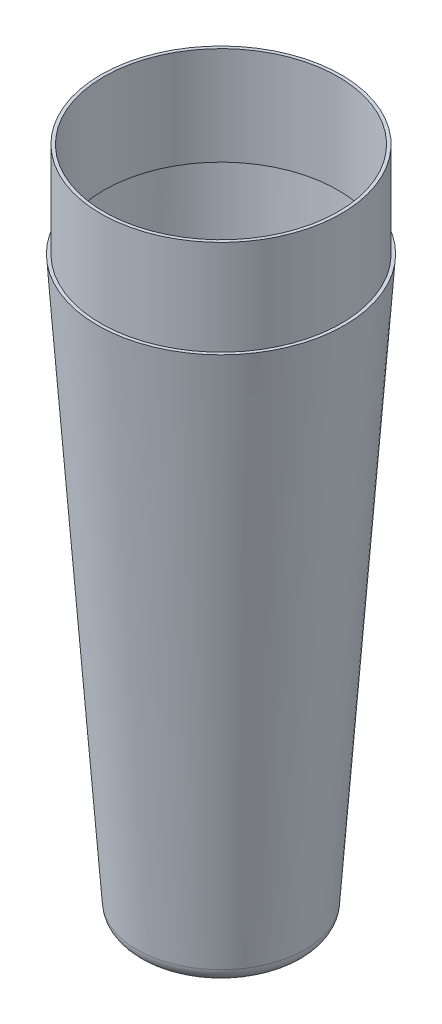
ISO-10303-21;
HEADER;
FILE_DESCRIPTION(('STEP AP214'),'2;1');
FILE_NAME('part.step','',(''),(''),'','','');
FILE_SCHEMA(('AUTOMOTIVE_DESIGN { 1 0 10303 214 1 1 1 1 }'));
ENDSEC;
DATA;
#1=APPLICATION_CONTEXT('core data for automotive mechanical design processes');
#2=APPLICATION_PROTOCOL_DEFINITION('international standard','automotive_design',2000,#1);
#3=PRODUCT_CONTEXT('',#1,'mechanical');
#4=PRODUCT('Part','Part','',(#3));
#5=PRODUCT_RELATED_PRODUCT_CATEGORY('part','',(#4));
#6=PRODUCT_DEFINITION_FORMATION('','',#4);
#7=PRODUCT_DEFINITION_CONTEXT('part definition',#1,'design');
#8=PRODUCT_DEFINITION('design','',#6,#7);
#9=PRODUCT_DEFINITION_SHAPE('','',#8);
#10=(LENGTH_UNIT() NAMED_UNIT(*) SI_UNIT(.MILLI.,.METRE.));
#11=(NAMED_UNIT(*) PLANE_ANGLE_UNIT() SI_UNIT($,.RADIAN.));
#12=(NAMED_UNIT(*) SI_UNIT($,.STERADIAN.) SOLID_ANGLE_UNIT());
#13=UNCERTAINTY_MEASURE_WITH_UNIT(LENGTH_MEASURE(1.E-05),#10,'distance_accuracy_value','');
#14=(GEOMETRIC_REPRESENTATION_CONTEXT(3) GLOBAL_UNCERTAINTY_ASSIGNED_CONTEXT((#13)) GLOBAL_UNIT_ASSIGNED_CONTEXT((#10,
#11,#12)) REPRESENTATION_CONTEXT('',''));
#15=CARTESIAN_POINT('',(0.,0.,0.));
#16=DIRECTION('',(0.,0.,1.));
#17=DIRECTION('',(1.,0.,0.));
#18=AXIS2_PLACEMENT_3D('',#15,#16,#17);
#19=CARTESIAN_POINT('',(0.,-112.,0.));
#20=DIRECTION('',(0.,-1.,0.));
#21=DIRECTION('',(1.,0.,0.));
#22=AXIS2_PLACEMENT_3D('',#19,#20,#21);
#23=PLANE('',#22);
#24=DIRECTION('',(0.,0.,1.));
#25=VECTOR('',#24,1.);
#26=CARTESIAN_POINT('',(-2.00000000000005,-112.,0.));
#27=LINE('',#26,#25);
#28=CARTESIAN_POINT('',(-2.00000000000005,-112.,-25.2208247287831));
#29=VERTEX_POINT('',#28);
#30=CARTESIAN_POINT('',(-2.00000000000005,-112.,25.2208247287831));
#31=VERTEX_POINT('',#30);
#32=EDGE_CURVE('E97',#29,#31,#27,.T.);
#33=ORIENTED_EDGE('',*,*,#32,.F.);
#34=CARTESIAN_POINT('',(0.,-112.,0.));
#35=DIRECTION('',(0.,1.,0.));
#36=DIRECTION('',(-1.,0.,0.));
#37=AXIS2_PLACEMENT_3D('',#34,#35,#36);
#38=CIRCLE('',#37,25.3);
#39=EDGE_CURVE('E102',#29,#31,#38,.T.);
#40=ORIENTED_EDGE('',*,*,#39,.T.);
#41=EDGE_LOOP('',(#33,#40));
#42=FACE_BOUND('',#41,.T.);
#43=ADVANCED_FACE('F30',(#42),#23,.F.);
#44=CARTESIAN_POINT('',(0.,62.1166994767691,0.));
#45=DIRECTION('',(0.,1.,0.));
#46=DIRECTION('',(-1.,0.,0.));
#47=AXIS2_PLACEMENT_3D('',#44,#45,#46);
#48=CONICAL_SURFACE('',#47,37.5859401150991,0.0704447682190461);
#49=CARTESIAN_POINT('',(0.,62.1166994767691,0.));
#50=DIRECTION('',(0.,1.,0.));
#51=DIRECTION('',(-1.,0.,0.));
#52=AXIS2_PLACEMENT_3D('',#49,#50,#51);
#53=CIRCLE('',#52,37.5859401150991);
#54=CARTESIAN_POINT('',(-37.5859401150991,62.1166994767691,0.));
#55=VERTEX_POINT('',#54);
#56=EDGE_CURVE('E108',#55,#55,#53,.T.);
#57=ORIENTED_EDGE('',*,*,#56,.T.);
#58=EDGE_LOOP('',(#57));
#59=FACE_BOUND('',#58,.T.);
#60=CARTESIAN_POINT('',(-2.00000000000005,-53.9138144700276,-29.3305406923571));
#61=CARTESIAN_POINT('',(-2.00000000000005,-61.9847140664111,-28.7597219553806));
#62=CARTESIAN_POINT('',(-2.00000000000005,-70.0556084181839,-28.1888290536397));
#63=CARTESIAN_POINT('',(-2.00000000000005,-86.197384059442,-27.0468587073202));
#64=CARTESIAN_POINT('',(-2.00000000000005,-94.2682653489273,-26.4757812627418));
#65=CARTESIAN_POINT('',(-2.00000000000005,-110.410012307659,-25.3334056163694));
#66=CARTESIAN_POINT('',(-2.00000000000005,-118.480877976906,-24.7621074145755));
#67=CARTESIAN_POINT('',(-2.00000000000005,-134.622589855425,-23.6192360748917));
#68=CARTESIAN_POINT('',(-2.00000000000005,-142.693436064698,-23.0476629370016));
#69=CARTESIAN_POINT('',(-2.00000000000005,-150.764270618845,-22.4759252419963));
#70=B_SPLINE_CURVE_WITH_KNOTS('',3,(#60,#61,#62,#63,#64,#65,#66,#67,#68,#69),.UNSPECIFIED.,.F.,
.F.,(4,2,2,2,4),(0.,24.2731804459495,48.5463608726504,72.8195413063129,97.0927217593087),.UNSPECIFIED.);
#71=CARTESIAN_POINT('',(-2.00000000000005,-93.8519325969335,-26.5052055677583));
#72=VERTEX_POINT('',#71);
#73=EDGE_CURVE('E145',#72,#29,#70,.T.);
#74=ORIENTED_EDGE('',*,*,#73,.F.);
#75=CARTESIAN_POINT('',(-2.00000000000005,-93.8519325969334,-26.5052055677583));
#76=CARTESIAN_POINT('',(-1.99999964109912,-93.7954523850104,-26.5092012035915));
#77=CARTESIAN_POINT('',(-1.99760603476506,-93.7390126500785,-26.5133767748526));
#78=CARTESIAN_POINT('',(-1.98806356505948,-93.6265659189259,-26.5220511012537));
#79=CARTESIAN_POINT('',(-1.9809150601534,-93.570558890406,-26.5265498320083));
#80=CARTESIAN_POINT('',(-1.9524170156751,-93.4038976507131,-26.5404603311732));
#81=CARTESIAN_POINT('',(-1.92401469690992,-93.2944018316317,-26.5503007433039));
#82=CARTESIAN_POINT('',(-1.8492289471911,-93.0818216874483,-26.5706499999928));
#83=CARTESIAN_POINT('',(-1.80283920424937,-92.9787396277579,-26.5811590781101));
#84=CARTESIAN_POINT('',(-1.69339644525837,-92.7818457908687,-26.6022764434111));
#85=CARTESIAN_POINT('',(-1.63034519005813,-92.6880330354948,-26.612884719997));
#86=CARTESIAN_POINT('',(-1.48915526943979,-92.512091561152,-26.6335923995208));
#87=CARTESIAN_POINT('',(-1.41097919495568,-92.4299927082182,-26.6436904607539));
#88=CARTESIAN_POINT('',(-1.24179703146071,-92.2800825311433,-26.662700126658));
#89=CARTESIAN_POINT('',(-1.15078874225654,-92.2122736621267,-26.6716115273553));
#90=CARTESIAN_POINT('',(-0.958813384917244,-92.0931243846404,-26.6876140148909));
#91=CARTESIAN_POINT('',(-0.857877364281296,-92.0417346429683,-26.6947105416598));
#92=CARTESIAN_POINT('',(-0.648696361268976,-91.9566972920407,-26.7066134451485));
#93=CARTESIAN_POINT('',(-0.54045656945448,-91.9230372295861,-26.711421429095));
#94=CARTESIAN_POINT('',(-0.359575138336308,-91.8831904169167,-26.7171468673316));
#95=CARTESIAN_POINT('',(-0.288127425834697,-91.8714770503591,-26.7188416078908));
#96=CARTESIAN_POINT('',(-0.144463931153968,-91.8558488553313,-26.7211088894329));
#97=CARTESIAN_POINT('',(-0.0722493077395498,-91.8519235876559,-26.7216829325875));
#98=CARTESIAN_POINT('',(0.,-91.8519325969334,-26.7216783932438));
#99=B_SPLINE_CURVE_WITH_KNOTS('',3,(#75,#76,#77,#78,#79,#80,#81,#82,#83,#84,#85,#86,#87,#88,#89,
#90,#91,#92,#93,#94,#95,#96,#97,#98),.UNSPECIFIED.,.F.,.F.,(4,2,2,2,2,2,2,2,2,2,2,4),(0.,
0.169758602458247,0.339504408492328,0.678397870790146,1.01741036237171,1.35638704020288,
1.69621310134062,2.03609749958529,2.37495085611892,2.71356588603529,2.93042856866167,
3.14700037059582),.UNSPECIFIED.);
#100=CARTESIAN_POINT('',(0.,-91.8519325969334,-26.7216783932439));
#101=VERTEX_POINT('',#100);
#102=EDGE_CURVE('E11',#72,#101,#99,.T.);
#103=ORIENTED_EDGE('',*,*,#102,.T.);
#104=CARTESIAN_POINT('',(0.,-91.8519325969334,-26.7216783932439));
#105=CARTESIAN_POINT('',(0.0559045914415745,-91.8519326412762,-26.7216793690392));
#106=CARTESIAN_POINT('',(0.111782182408543,-91.8542780774041,-26.7213372338973));
#107=CARTESIAN_POINT('',(0.223132940230656,-91.8636327940734,-26.7199790269486));
#108=CARTESIAN_POINT('',(0.278606138249945,-91.8706417113036,-26.7189630076414));
#109=CARTESIAN_POINT('',(0.443684499036767,-91.898586221238,-26.7149278981273));
#110=CARTESIAN_POINT('',(0.552176627522144,-91.92643982581,-26.7109216560388));
#111=CARTESIAN_POINT('',(0.762882888304906,-91.9997781527207,-26.7005588010871));
#112=CARTESIAN_POINT('',(0.865094897431321,-92.0452688001743,-26.6942013983913));
#113=CARTESIAN_POINT('',(1.06042699906275,-92.152549413548,-26.6795798705328));
#114=CARTESIAN_POINT('',(1.15354759741405,-92.2143384719152,-26.6713158515404));
#115=CARTESIAN_POINT('',(1.32864189264113,-92.3528508095469,-26.6533835253543));
#116=CARTESIAN_POINT('',(1.41054866352324,-92.4296576294896,-26.6437074432609));
#117=CARTESIAN_POINT('',(1.56036311266941,-92.5958343234032,-26.6236083984379));
#118=CARTESIAN_POINT('',(1.6282676382264,-92.6852070190703,-26.6131852682153));
#119=CARTESIAN_POINT('',(1.74869467198883,-92.874800324391,-26.5921384674369));
#120=CARTESIAN_POINT('',(1.80108511554346,-92.9751046536976,-26.5815138509223));
#121=CARTESIAN_POINT('',(1.88822408856338,-93.1831222855994,-26.5607514239104));
#122=CARTESIAN_POINT('',(1.92298284943401,-93.2908312500912,-26.5506133341885));
#123=CARTESIAN_POINT('',(1.96555115658719,-93.4746031037899,-26.534486256957));
#124=CARTESIAN_POINT('',(1.97845588219058,-93.5495015894461,-26.5282242783961));
#125=CARTESIAN_POINT('',(1.99568030677068,-93.700225367144,-26.5162666668877));
#126=CARTESIAN_POINT('',(2.0000109905118,-93.7760493479264,-26.5105703181789));
#127=CARTESIAN_POINT('',(2.00000000000005,-93.8519325969334,-26.5052055677583));
#128=B_SPLINE_CURVE_WITH_KNOTS('',3,(#104,#105,#106,#107,#108,#109,#110,#111,#112,#113,#114,
#115,#116,#117,#118,#119,#120,#121,#122,#123,#124,#125,#126,#127),.UNSPECIFIED.,.F.,.F.,(4,2,2,
2,2,2,2,2,2,2,2,4),(0.,0.167610038300645,0.335207020374809,0.669725159066295,1.00435577569958,
1.33896776285442,1.67549698982164,2.01210190624716,2.35149485189112,2.69069062686982,
2.91900910508339,3.14703487982209),.UNSPECIFIED.);
#129=CARTESIAN_POINT('',(2.00000000000005,-93.8519325969334,-26.5052055677583));
#130=VERTEX_POINT('',#129);
#131=EDGE_CURVE('E159',#101,#130,#128,.T.);
#132=ORIENTED_EDGE('',*,*,#131,.T.);
#133=CARTESIAN_POINT('',(2.00000000000005,-53.9138144700276,-29.3305406923571));
#134=CARTESIAN_POINT('',(2.00000000000005,-61.9847140664111,-28.7597219553806));
#135=CARTESIAN_POINT('',(2.00000000000005,-70.0556084181839,-28.1888290536397));
#136=CARTESIAN_POINT('',(2.00000000000005,-86.197384059442,-27.0468587073202));
#137=CARTESIAN_POINT('',(2.00000000000005,-94.2682653489273,-26.4757812627418));
#138=CARTESIAN_POINT('',(2.00000000000005,-110.410012307659,-25.3334056163695));
#139=CARTESIAN_POINT('',(2.00000000000005,-118.480877976906,-24.7621074145755));
#140=CARTESIAN_POINT('',(2.00000000000005,-134.622589855425,-23.6192360748917));
#141=CARTESIAN_POINT('',(2.00000000000005,-142.693436064698,-23.0476629370016));
#142=CARTESIAN_POINT('',(2.00000000000005,-150.764270618845,-22.4759252419963));
#143=B_SPLINE_CURVE_WITH_KNOTS('',3,(#133,#134,#135,#136,#137,#138,#139,#140,#141,#142),
.UNSPECIFIED.,.F.,.F.,(4,2,2,2,4),(0.,24.2731804459495,48.5463608726504,72.8195413063129,
97.0927217593087),.UNSPECIFIED.);
#144=CARTESIAN_POINT('',(2.00000000000005,-112.,-25.2208247287832));
#145=VERTEX_POINT('',#144);
#146=EDGE_CURVE('E100',#130,#145,#143,.T.);
#147=ORIENTED_EDGE('',*,*,#146,.T.);
#148=CARTESIAN_POINT('',(2.00000000000005,-112.,25.2208247287831));
#149=VERTEX_POINT('',#148);
#150=EDGE_CURVE('E96',#149,#145,#38,.T.);
#151=ORIENTED_EDGE('',*,*,#150,.F.);
#152=CARTESIAN_POINT('',(2.00000000000005,-150.764270618845,22.4759252419963));
#153=CARTESIAN_POINT('',(2.00000000000005,-136.745453788652,23.4690087769636));
#154=CARTESIAN_POINT('',(2.00000000000005,-122.726602954231,24.4616120896159));
#155=CARTESIAN_POINT('',(2.00000000000005,-106.58486459877,25.604109386239));
#156=CARTESIAN_POINT('',(2.00000000000005,-104.462001990521,25.7543553347007));
#157=CARTESIAN_POINT('',(2.00000000000005,-86.1973918091656,27.0469682870499));
#158=CARTESIAN_POINT('',(2.00000000000005,-70.0556126947938,28.1888896437956));
#159=CARTESIAN_POINT('',(2.00000000000005,-53.9138144700276,29.3305406923571));
#160=B_SPLINE_CURVE_WITH_KNOTS('',3,(#152,#153,#154,#155,#156,#157,#158,#159),.UNSPECIFIED.,.F.,
.F.,(4,2,2,4),(0.,42.1618424601069,48.5463608825223,97.092721752),.UNSPECIFIED.);
#161=CARTESIAN_POINT('',(2.00000000000005,-93.8519325969334,26.5052055677583));
#162=VERTEX_POINT('',#161);
#163=EDGE_CURVE('E82',#149,#162,#160,.T.);
#164=ORIENTED_EDGE('',*,*,#163,.T.);
#165=CARTESIAN_POINT('',(2.00000000000005,-93.8519325969334,26.5052055677583));
#166=CARTESIAN_POINT('',(1.99999964109912,-93.7954523850104,26.5092012035915));
#167=CARTESIAN_POINT('',(1.99760603476506,-93.7390126500785,26.5133767748526));
#168=CARTESIAN_POINT('',(1.98806356505948,-93.6265659189259,26.5220511012537));
#169=CARTESIAN_POINT('',(1.9809150601534,-93.570558890406,26.5265498320083));
#170=CARTESIAN_POINT('',(1.9524170156751,-93.4038976507131,26.5404603311732));
#171=CARTESIAN_POINT('',(1.92401469690992,-93.2944018316317,26.5503007433039));
#172=CARTESIAN_POINT('',(1.8492289471911,-93.0818216874483,26.5706499999928));
#173=CARTESIAN_POINT('',(1.80283920424937,-92.9787396277579,26.5811590781101));
#174=CARTESIAN_POINT('',(1.69339644525837,-92.7818457908687,26.6022764434111));
#175=CARTESIAN_POINT('',(1.63034519005813,-92.6880330354948,26.612884719997));
#176=CARTESIAN_POINT('',(1.48915526943979,-92.512091561152,26.6335923995208));
#177=CARTESIAN_POINT('',(1.41097919495568,-92.4299927082182,26.6436904607539));
#178=CARTESIAN_POINT('',(1.24179703146071,-92.2800825311433,26.662700126658));
#179=CARTESIAN_POINT('',(1.15078874225654,-92.2122736621267,26.6716115273553));
#180=CARTESIAN_POINT('',(0.958813384917244,-92.0931243846404,26.6876140148909));
#181=CARTESIAN_POINT('',(0.857877364281296,-92.0417346429683,26.6947105416598));
#182=CARTESIAN_POINT('',(0.648696361268976,-91.9566972920407,26.7066134451485));
#183=CARTESIAN_POINT('',(0.540456569454481,-91.9230372295861,26.711421429095));
#184=CARTESIAN_POINT('',(0.359575138336308,-91.8831904169167,26.7171468673316));
#185=CARTESIAN_POINT('',(0.288127425834696,-91.8714770503591,26.7188416078908));
#186=CARTESIAN_POINT('',(0.144463931153966,-91.8558488553313,26.7211088894329));
#187=CARTESIAN_POINT('',(0.0722493077395496,-91.8519235876559,26.7216829325875));
#188=CARTESIAN_POINT('',(0.,-91.8519325969334,26.7216783932438));
#189=B_SPLINE_CURVE_WITH_KNOTS('',3,(#165,#166,#167,#168,#169,#170,#171,#172,#173,#174,#175,
#176,#177,#178,#179,#180,#181,#182,#183,#184,#185,#186,#187,#188),.UNSPECIFIED.,.F.,.F.,(4,2,2,
2,2,2,2,2,2,2,2,4),(0.,0.169758602458246,0.339504408492327,0.678397870790146,1.01741036237171,
1.35638704020288,1.69621310134062,2.03609749958529,2.37495085611892,2.71356588603529,
2.93042856866167,3.14700037059581),.UNSPECIFIED.);
#190=CARTESIAN_POINT('',(0.,-91.8519325969334,26.7216783932438));
#191=VERTEX_POINT('',#190);
#192=EDGE_CURVE('E154',#162,#191,#189,.T.);
#193=ORIENTED_EDGE('',*,*,#192,.T.);
#194=CARTESIAN_POINT('',(0.,-91.8519325969334,26.7216783932438));
#195=CARTESIAN_POINT('',(-0.0559045914415748,-91.8519326412762,26.7216793690392));
#196=CARTESIAN_POINT('',(-0.111782182408543,-91.8542780774041,26.7213372338973));
#197=CARTESIAN_POINT('',(-0.223132940230656,-91.8636327940734,26.7199790269487));
#198=CARTESIAN_POINT('',(-0.278606138249945,-91.8706417113036,26.7189630076414));
#199=CARTESIAN_POINT('',(-0.443684499036768,-91.898586221238,26.7149278981273));
#200=CARTESIAN_POINT('',(-0.552176627522145,-91.92643982581,26.7109216560388));
#201=CARTESIAN_POINT('',(-0.762882888304904,-91.9997781527207,26.7005588010871));
#202=CARTESIAN_POINT('',(-0.865094897431316,-92.0452688001743,26.6942013983913));
#203=CARTESIAN_POINT('',(-1.06042699906274,-92.152549413548,26.6795798705328));
#204=CARTESIAN_POINT('',(-1.15354759741405,-92.2143384719152,26.6713158515404));
#205=CARTESIAN_POINT('',(-1.32864189264113,-92.3528508095469,26.6533835253543));
#206=CARTESIAN_POINT('',(-1.41054866352324,-92.4296576294896,26.6437074432609));
#207=CARTESIAN_POINT('',(-1.56036311266941,-92.5958343234032,26.6236083984379));
#208=CARTESIAN_POINT('',(-1.6282676382264,-92.6852070190703,26.6131852682153));
#209=CARTESIAN_POINT('',(-1.74869467198883,-92.874800324391,26.5921384674369));
#210=CARTESIAN_POINT('',(-1.80108511554346,-92.9751046536976,26.5815138509223));
#211=CARTESIAN_POINT('',(-1.88822408856338,-93.1831222855994,26.5607514239104));
#212=CARTESIAN_POINT('',(-1.92298284943401,-93.2908312500912,26.5506133341885));
#213=CARTESIAN_POINT('',(-1.96555115658719,-93.4746031037899,26.534486256957));
#214=CARTESIAN_POINT('',(-1.97845588219058,-93.5495015894461,26.5282242783961));
#215=CARTESIAN_POINT('',(-1.99568030677068,-93.700225367144,26.5162666668877));
#216=CARTESIAN_POINT('',(-2.0000109905118,-93.7760493479264,26.5105703181789));
#217=CARTESIAN_POINT('',(-2.00000000000005,-93.8519325969334,26.5052055677583));
#218=B_SPLINE_CURVE_WITH_KNOTS('',3,(#194,#195,#196,#197,#198,#199,#200,#201,#202,#203,#204,
#205,#206,#207,#208,#209,#210,#211,#212,#213,#214,#215,#216,#217),.UNSPECIFIED.,.F.,.F.,(4,2,2,
2,2,2,2,2,2,2,2,4),(0.,0.167610038300645,0.33520702037481,0.669725159066295,1.00435577569958,
1.33896776285442,1.67549698982164,2.01210190624716,2.35149485189112,2.69069062686982,
2.91900910508339,3.1470348798221),.UNSPECIFIED.);
#219=CARTESIAN_POINT('',(-2.00000000000005,-93.8519325969334,26.5052055677583));
#220=VERTEX_POINT('',#219);
#221=EDGE_CURVE('E43',#191,#220,#218,.T.);
#222=ORIENTED_EDGE('',*,*,#221,.T.);
#223=CARTESIAN_POINT('',(-2.00000000000005,-150.764270618845,22.4759252419963));
#224=CARTESIAN_POINT('',(-2.00000000000005,-136.745453788652,23.4690087769636));
#225=CARTESIAN_POINT('',(-2.00000000000005,-122.726602954231,24.4616120896159));
#226=CARTESIAN_POINT('',(-2.00000000000005,-106.58486459877,25.604109386239));
#227=CARTESIAN_POINT('',(-2.00000000000005,-104.462001990521,25.7543553347007));
#228=CARTESIAN_POINT('',(-2.00000000000005,-86.1973918091656,27.0469682870499));
#229=CARTESIAN_POINT('',(-2.00000000000005,-70.0556126947934,28.1888896437956));
#230=CARTESIAN_POINT('',(-2.00000000000005,-53.9138144700276,29.3305406923571));
#231=B_SPLINE_CURVE_WITH_KNOTS('',3,(#223,#224,#225,#226,#227,#228,#229,#230),.UNSPECIFIED.,.F.,
.F.,(4,2,2,4),(0.,42.1618424601068,48.5463608825223,97.092721752),.UNSPECIFIED.);
#232=EDGE_CURVE('E91',#31,#220,#231,.T.);
#233=ORIENTED_EDGE('',*,*,#232,.F.);
#234=ORIENTED_EDGE('',*,*,#39,.F.);
#235=EDGE_LOOP('',(#74,#103,#132,#147,#151,#164,#193,#222,#233,#234));
#236=FACE_BOUND('',#235,.T.);
#237=ADVANCED_FACE('F99',(#59,#236),#48,.F.);
#238=CARTESIAN_POINT('',(-36.6559401150991,92.8909367921992,0.));
#239=DIRECTION('',(0.,1.,0.));
#240=DIRECTION('',(-1.,0.,0.));
#241=AXIS2_PLACEMENT_3D('',#238,#239,#240);
#242=PLANE('',#241);
#243=CARTESIAN_POINT('',(0.,92.8909367921992,0.));
#244=DIRECTION('',(0.,1.,0.));
#245=DIRECTION('',(-1.,0.,0.));
#246=AXIS2_PLACEMENT_3D('',#243,#244,#245);
#247=CIRCLE('',#246,36.6559401150991);
#248=CARTESIAN_POINT('',(-36.6559401150991,92.8909367921992,0.));
#249=VERTEX_POINT('',#248);
#250=EDGE_CURVE('E207',#249,#249,#247,.T.);
#251=ORIENTED_EDGE('',*,*,#250,.F.);
#252=EDGE_LOOP('',(#251));
#253=FACE_BOUND('',#252,.T.);
#254=CARTESIAN_POINT('',(0.,92.8909367921992,0.));
#255=DIRECTION('',(0.,1.,0.));
#256=DIRECTION('',(-1.,0.,0.));
#257=AXIS2_PLACEMENT_3D('',#254,#255,#256);
#258=CIRCLE('',#257,37.6559401150991);
#259=CARTESIAN_POINT('',(-37.6559401150991,92.8909367921992,0.));
#260=VERTEX_POINT('',#259);
#261=EDGE_CURVE('E101',#260,#260,#258,.T.);
#262=ORIENTED_EDGE('',*,*,#261,.T.);
#263=EDGE_LOOP('',(#262));
#264=FACE_BOUND('',#263,.T.);
#265=ADVANCED_FACE('F189',(#253,#264),#242,.T.);
#266=CARTESIAN_POINT('',(0.,-117.,0.));
#267=DIRECTION('',(0.,-1.,0.));
#268=DIRECTION('',(1.,0.,0.));
#269=AXIS2_PLACEMENT_3D('',#266,#267,#268);
#270=PLANE('',#269);
#271=CARTESIAN_POINT('',(0.,-117.,0.));
#272=DIRECTION('',(0.,-1.,0.));
#273=DIRECTION('',(1.,0.,0.));
#274=AXIS2_PLACEMENT_3D('',#271,#272,#273);
#275=CIRCLE('',#274,21.2900545060446);
#276=CARTESIAN_POINT('',(21.2900545060446,-117.,0.));
#277=VERTEX_POINT('',#276);
#278=EDGE_CURVE('E92',#277,#277,#275,.T.);
#279=ORIENTED_EDGE('',*,*,#278,.T.);
#280=EDGE_LOOP('',(#279));
#281=FACE_BOUND('',#280,.T.);
#282=ADVANCED_FACE('F185',(#281),#270,.T.);
#283=CARTESIAN_POINT('',(0.,62.0463129573824,0.));
#284=DIRECTION('',(0.,1.,0.));
#285=DIRECTION('',(-1.,0.,0.));
#286=AXIS2_PLACEMENT_3D('',#283,#284,#285);
#287=CONICAL_SURFACE('',#286,38.5834599083306,0.0704447682190461);
#288=CARTESIAN_POINT('',(0.,-112.351932596933,0.));
#289=DIRECTION('',(0.,-1.,0.));
#290=DIRECTION('',(1.,0.,0.));
#291=AXIS2_PLACEMENT_3D('',#288,#289,#290);
#292=CIRCLE('',#291,26.2776534722021);
#293=CARTESIAN_POINT('',(26.2776534722021,-112.351932596933,0.));
#294=VERTEX_POINT('',#293);
#295=EDGE_CURVE('E115',#294,#294,#292,.F.);
#296=ORIENTED_EDGE('',*,*,#295,.T.);
#297=EDGE_LOOP('',(#296));
#298=FACE_BOUND('',#297,.T.);
#299=CARTESIAN_POINT('',(0.,63.1166994767691,0.));
#300=DIRECTION('',(0.,1.,0.));
#301=DIRECTION('',(-1.,0.,0.));
#302=AXIS2_PLACEMENT_3D('',#299,#300,#301);
#303=CIRCLE('',#302,38.6589880151504);
#304=CARTESIAN_POINT('',(-38.6589880151504,63.1166994767691,0.));
#305=VERTEX_POINT('',#304);
#306=EDGE_CURVE('E112',#305,#305,#303,.T.);
#307=ORIENTED_EDGE('',*,*,#306,.F.);
#308=EDGE_LOOP('',(#307));
#309=FACE_BOUND('',#308,.T.);
#310=ADVANCED_FACE('F181',(#298,#309),#287,.T.);
#311=CARTESIAN_POINT('',(-37.5859401150991,63.1166994767691,0.));
#312=DIRECTION('',(0.,1.,0.));
#313=DIRECTION('',(-1.,0.,0.));
#314=AXIS2_PLACEMENT_3D('',#311,#312,#313);
#315=PLANE('',#314);
#316=ORIENTED_EDGE('',*,*,#306,.T.);
#317=EDGE_LOOP('',(#316));
#318=FACE_BOUND('',#317,.T.);
#319=CARTESIAN_POINT('',(0.,63.1166994767691,0.));
#320=DIRECTION('',(0.,1.,0.));
#321=DIRECTION('',(-1.,0.,0.));
#322=AXIS2_PLACEMENT_3D('',#319,#320,#321);
#323=CIRCLE('',#322,37.6559401150991);
#324=CARTESIAN_POINT('',(-37.6559401150991,63.1166994767691,0.));
#325=VERTEX_POINT('',#324);
#326=EDGE_CURVE('E105',#325,#325,#323,.T.);
#327=ORIENTED_EDGE('',*,*,#326,.F.);
#328=EDGE_LOOP('',(#327));
#329=FACE_BOUND('',#328,.T.);
#330=ADVANCED_FACE('F177',(#318,#329),#315,.T.);
#331=CARTESIAN_POINT('',(0.,0.,0.));
#332=DIRECTION('',(0.,1.,0.));
#333=DIRECTION('',(-1.,0.,0.));
#334=AXIS2_PLACEMENT_3D('',#331,#332,#333);
#335=CYLINDRICAL_SURFACE('',#334,37.6559401150991);
#336=ORIENTED_EDGE('',*,*,#326,.T.);
#337=EDGE_LOOP('',(#336));
#338=FACE_BOUND('',#337,.T.);
#339=ORIENTED_EDGE('',*,*,#261,.F.);
#340=EDGE_LOOP('',(#339));
#341=FACE_BOUND('',#340,.T.);
#342=ADVANCED_FACE('F174',(#338,#341),#335,.T.);
#343=ORIENTED_EDGE('',*,*,#150,.T.);
#344=DIRECTION('',(0.,0.,1.));
#345=VECTOR('',#344,1.);
#346=CARTESIAN_POINT('',(2.00000000000005,-112.,0.));
#347=LINE('',#346,#345);
#348=EDGE_CURVE('E86',#145,#149,#347,.T.);
#349=ORIENTED_EDGE('',*,*,#348,.T.);
#350=EDGE_LOOP('',(#343,#349));
#351=FACE_BOUND('',#350,.T.);
#352=ADVANCED_FACE('F95',(#351),#23,.F.);
#353=CARTESIAN_POINT('',(-37.5859401150991,62.1166994767691,0.));
#354=DIRECTION('',(0.,1.,0.));
#355=DIRECTION('',(-1.,0.,0.));
#356=AXIS2_PLACEMENT_3D('',#353,#354,#355);
#357=PLANE('',#356);
#358=ORIENTED_EDGE('',*,*,#56,.F.);
#359=EDGE_LOOP('',(#358));
#360=FACE_BOUND('',#359,.T.);
#361=CARTESIAN_POINT('',(0.,62.1166994767691,0.));
#362=DIRECTION('',(0.,1.,0.));
#363=DIRECTION('',(-1.,0.,0.));
#364=AXIS2_PLACEMENT_3D('',#361,#362,#363);
#365=CIRCLE('',#364,36.6559401150991);
#366=CARTESIAN_POINT('',(-36.6559401150991,62.1166994767691,0.));
#367=VERTEX_POINT('',#366);
#368=EDGE_CURVE('E309',#367,#367,#365,.T.);
#369=ORIENTED_EDGE('',*,*,#368,.T.);
#370=EDGE_LOOP('',(#369));
#371=FACE_BOUND('',#370,.T.);
#372=ADVANCED_FACE('F194',(#360,#371),#357,.F.);
#373=CARTESIAN_POINT('',(0.,0.,0.));
#374=DIRECTION('',(0.,1.,0.));
#375=DIRECTION('',(-1.,0.,0.));
#376=AXIS2_PLACEMENT_3D('',#373,#374,#375);
#377=CYLINDRICAL_SURFACE('',#376,36.6559401150991);
#378=ORIENTED_EDGE('',*,*,#368,.F.);
#379=EDGE_LOOP('',(#378));
#380=FACE_BOUND('',#379,.T.);
#381=ORIENTED_EDGE('',*,*,#250,.T.);
#382=EDGE_LOOP('',(#381));
#383=FACE_BOUND('',#382,.T.);
#384=ADVANCED_FACE('F172',(#380,#383),#377,.F.);
#385=CARTESIAN_POINT('',(0.,-112.,0.));
#386=DIRECTION('',(0.,-1.,0.));
#387=DIRECTION('',(1.,0.,0.));
#388=AXIS2_PLACEMENT_3D('',#385,#386,#387);
#389=TOROIDAL_SURFACE('',#388,21.2900545060446,5.);
#390=ORIENTED_EDGE('',*,*,#278,.F.);
#391=EDGE_LOOP('',(#390));
#392=FACE_BOUND('',#391,.T.);
#393=ORIENTED_EDGE('',*,*,#295,.F.);
#394=EDGE_LOOP('',(#393));
#395=FACE_BOUND('',#394,.T.);
#396=ADVANCED_FACE('F168',(#392,#395),#389,.T.);
#397=CARTESIAN_POINT('',(-2.00000000000005,-112.351932596933,25.32));
#398=DIRECTION('',(1.,0.,0.));
#399=DIRECTION('',(0.,0.,-1.));
#400=AXIS2_PLACEMENT_3D('',#397,#398,#399);
#401=PLANE('',#400);
#402=ORIENTED_EDGE('',*,*,#232,.T.);
#403=DIRECTION('',(0.,0.,1.));
#404=VECTOR('',#403,1.);
#405=CARTESIAN_POINT('',(-2.00000000000005,-93.8519325969334,-26.6467276818741));
#406=LINE('',#405,#404);
#407=EDGE_CURVE('E56',#220,#72,#406,.F.);
#408=ORIENTED_EDGE('',*,*,#407,.T.);
#409=ORIENTED_EDGE('',*,*,#73,.T.);
#410=ORIENTED_EDGE('',*,*,#32,.T.);
#411=EDGE_LOOP('',(#402,#408,#409,#410));
#412=FACE_BOUND('',#411,.T.);
#413=ADVANCED_FACE('F137',(#412),#401,.F.);
#414=CARTESIAN_POINT('',(2.00000000000005,-112.351932596933,25.32));
#415=DIRECTION('',(1.,0.,0.));
#416=DIRECTION('',(0.,0.,-1.));
#417=AXIS2_PLACEMENT_3D('',#414,#415,#416);
#418=PLANE('',#417);
#419=ORIENTED_EDGE('',*,*,#146,.F.);
#420=DIRECTION('',(0.,0.,1.));
#421=VECTOR('',#420,1.);
#422=CARTESIAN_POINT('',(2.00000000000005,-93.8519325969334,25.32));
#423=LINE('',#422,#421);
#424=EDGE_CURVE('E89',#130,#162,#423,.T.);
#425=ORIENTED_EDGE('',*,*,#424,.T.);
#426=ORIENTED_EDGE('',*,*,#163,.F.);
#427=ORIENTED_EDGE('',*,*,#348,.F.);
#428=EDGE_LOOP('',(#419,#425,#426,#427));
#429=FACE_BOUND('',#428,.T.);
#430=ADVANCED_FACE('F85',(#429),#418,.T.);
#431=CARTESIAN_POINT('',(0.,-93.8519325969334,25.32));
#432=DIRECTION('',(0.,0.,1.));
#433=DIRECTION('',(1.,0.,0.));
#434=AXIS2_PLACEMENT_3D('',#431,#432,#433);
#435=CYLINDRICAL_SURFACE('',#434,2.);
#436=ORIENTED_EDGE('',*,*,#131,.F.);
#437=DIRECTION('',(0.,0.,1.));
#438=VECTOR('',#437,1.);
#439=CARTESIAN_POINT('',(0.,-91.8519325969334,-26.77));
#440=LINE('',#439,#438);
#441=EDGE_CURVE('E151',#191,#101,#440,.F.);
#442=ORIENTED_EDGE('',*,*,#441,.F.);
#443=ORIENTED_EDGE('',*,*,#192,.F.);
#444=ORIENTED_EDGE('',*,*,#424,.F.);
#445=EDGE_LOOP('',(#436,#442,#443,#444));
#446=FACE_BOUND('',#445,.T.);
#447=ADVANCED_FACE('F136',(#446),#435,.T.);
#448=CARTESIAN_POINT('',(0.,-93.8519325969334,-26.77));
#449=DIRECTION('',(0.,0.,-1.));
#450=DIRECTION('',(-1.,0.,0.));
#451=AXIS2_PLACEMENT_3D('',#448,#449,#450);
#452=CYLINDRICAL_SURFACE('',#451,2.);
#453=ORIENTED_EDGE('',*,*,#102,.F.);
#454=ORIENTED_EDGE('',*,*,#407,.F.);
#455=ORIENTED_EDGE('',*,*,#221,.F.);
#456=ORIENTED_EDGE('',*,*,#441,.T.);
#457=EDGE_LOOP('',(#453,#454,#455,#456));
#458=FACE_BOUND('',#457,.T.);
#459=ADVANCED_FACE('F32',(#458),#452,.T.);
#460=CLOSED_SHELL('',(#43,#237,#265,#282,#310,#330,#342,#352,#372,#384,#396,#413,#430,#447,#459));
#461=MANIFOLD_SOLID_BREP('B2',#460);
#462=ADVANCED_BREP_SHAPE_REPRESENTATION('',(#18,#461),#14);
#463=SHAPE_DEFINITION_REPRESENTATION(#9,#462);
ENDSEC;
END-ISO-10303-21;
